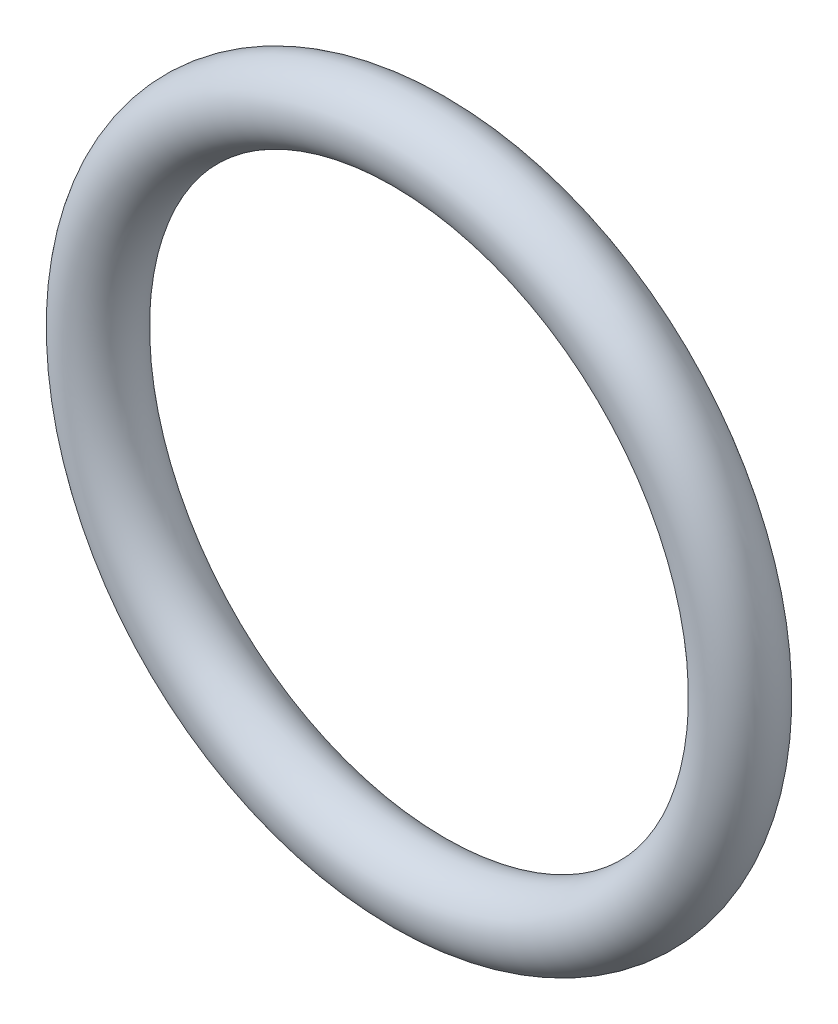
ISO-10303-21;
HEADER;
FILE_DESCRIPTION(('STEP AP214'),'2;1');
FILE_NAME('part.step','',(''),(''),'','','');
FILE_SCHEMA(('AUTOMOTIVE_DESIGN { 1 0 10303 214 1 1 1 1 }'));
ENDSEC;
DATA;
#1=APPLICATION_CONTEXT('core data for automotive mechanical design processes');
#2=APPLICATION_PROTOCOL_DEFINITION('international standard','automotive_design',2000,#1);
#3=PRODUCT_CONTEXT('',#1,'mechanical');
#4=PRODUCT('Part','Part','',(#3));
#5=PRODUCT_RELATED_PRODUCT_CATEGORY('part','',(#4));
#6=PRODUCT_DEFINITION_FORMATION('','',#4);
#7=PRODUCT_DEFINITION_CONTEXT('part definition',#1,'design');
#8=PRODUCT_DEFINITION('design','',#6,#7);
#9=PRODUCT_DEFINITION_SHAPE('','',#8);
#10=(LENGTH_UNIT() NAMED_UNIT(*) SI_UNIT(.MILLI.,.METRE.));
#11=(NAMED_UNIT(*) PLANE_ANGLE_UNIT() SI_UNIT($,.RADIAN.));
#12=(NAMED_UNIT(*) SI_UNIT($,.STERADIAN.) SOLID_ANGLE_UNIT());
#13=UNCERTAINTY_MEASURE_WITH_UNIT(LENGTH_MEASURE(1.E-05),#10,'distance_accuracy_value','');
#14=(GEOMETRIC_REPRESENTATION_CONTEXT(3) GLOBAL_UNCERTAINTY_ASSIGNED_CONTEXT((#13)) GLOBAL_UNIT_ASSIGNED_CONTEXT((#10,
#11,#12)) REPRESENTATION_CONTEXT('',''));
#15=CARTESIAN_POINT('',(0.,0.,0.));
#16=DIRECTION('',(0.,0.,1.));
#17=DIRECTION('',(1.,0.,0.));
#18=AXIS2_PLACEMENT_3D('',#15,#16,#17);
#19=CARTESIAN_POINT('',(0.,0.,0.));
#20=DIRECTION('',(0.,0.,1.));
#21=DIRECTION('',(1.,0.,0.));
#22=AXIS2_PLACEMENT_3D('',#19,#20,#21);
#23=TOROIDAL_SURFACE('',#22,10.8204,1.2319);
#24=CARTESIAN_POINT('',(0.,-10.8204,0.));
#25=DIRECTION('',(1.,0.,0.));
#26=DIRECTION('',(0.,0.,-1.));
#27=AXIS2_PLACEMENT_3D('',#24,#25,#26);
#28=CIRCLE('',#27,1.2319);
#29=CARTESIAN_POINT('',(0.,-12.0523,0.));
#30=VERTEX_POINT('',#29);
#31=EDGE_CURVE('E10',#30,#30,#28,.T.);
#32=CARTESIAN_POINT('',(0.,0.,0.));
#33=DIRECTION('',(0.,0.,1.));
#34=DIRECTION('',(1.,0.,0.));
#35=AXIS2_PLACEMENT_3D('',#32,#33,#34);
#36=CIRCLE('',#35,12.0523);
#37=EDGE_CURVE('',#30,#30,#36,.T.);
#38=ORIENTED_EDGE('',*,*,#31,.T.);
#39=ORIENTED_EDGE('',*,*,#31,.F.);
#40=ORIENTED_EDGE('',*,*,#37,.T.);
#41=ORIENTED_EDGE('',*,*,#37,.F.);
#42=EDGE_LOOP('',(#38,#40,#39,#41));
#43=FACE_BOUND('',#42,.T.);
#44=ADVANCED_FACE('F37',(#43),#23,.T.);
#45=CLOSED_SHELL('',(#44));
#46=MANIFOLD_SOLID_BREP('B2',#45);
#47=ADVANCED_BREP_SHAPE_REPRESENTATION('',(#18,#46),#14);
#48=SHAPE_DEFINITION_REPRESENTATION(#9,#47);
ENDSEC;
END-ISO-10303-21;
